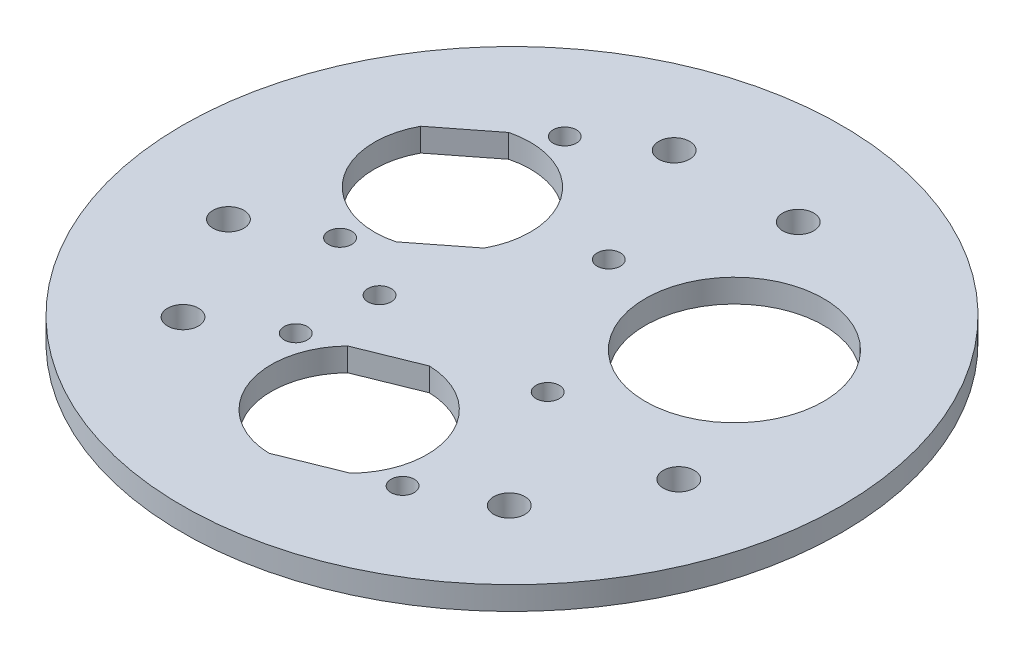
ISO-10303-21;
HEADER;
FILE_DESCRIPTION(('STEP AP214'),'2;1');
FILE_NAME('part.step','',(''),(''),'','','');
FILE_SCHEMA(('AUTOMOTIVE_DESIGN { 1 0 10303 214 1 1 1 1 }'));
ENDSEC;
DATA;
#1=APPLICATION_CONTEXT('core data for automotive mechanical design processes');
#2=APPLICATION_PROTOCOL_DEFINITION('international standard','automotive_design',2000,#1);
#3=PRODUCT_CONTEXT('',#1,'mechanical');
#4=PRODUCT('Part','Part','',(#3));
#5=PRODUCT_RELATED_PRODUCT_CATEGORY('part','',(#4));
#6=PRODUCT_DEFINITION_FORMATION('','',#4);
#7=PRODUCT_DEFINITION_CONTEXT('part definition',#1,'design');
#8=PRODUCT_DEFINITION('design','',#6,#7);
#9=PRODUCT_DEFINITION_SHAPE('','',#8);
#10=(LENGTH_UNIT() NAMED_UNIT(*) SI_UNIT(.MILLI.,.METRE.));
#11=(NAMED_UNIT(*) PLANE_ANGLE_UNIT() SI_UNIT($,.RADIAN.));
#12=(NAMED_UNIT(*) SI_UNIT($,.STERADIAN.) SOLID_ANGLE_UNIT());
#13=UNCERTAINTY_MEASURE_WITH_UNIT(LENGTH_MEASURE(1.E-05),#10,'distance_accuracy_value','');
#14=(GEOMETRIC_REPRESENTATION_CONTEXT(3) GLOBAL_UNCERTAINTY_ASSIGNED_CONTEXT((#13)) GLOBAL_UNIT_ASSIGNED_CONTEXT((#10,
#11,#12)) REPRESENTATION_CONTEXT('',''));
#15=CARTESIAN_POINT('',(0.,0.,0.));
#16=DIRECTION('',(0.,0.,1.));
#17=DIRECTION('',(1.,0.,0.));
#18=AXIS2_PLACEMENT_3D('',#15,#16,#17);
#19=CARTESIAN_POINT('',(0.,-72.,21.));
#20=DIRECTION('',(0.,-1.,0.));
#21=DIRECTION('',(0.,0.,1.));
#22=AXIS2_PLACEMENT_3D('',#19,#20,#21);
#23=CYLINDRICAL_SURFACE('',#22,10.05);
#24=CARTESIAN_POINT('',(0.,-74.,21.));
#25=DIRECTION('',(0.,1.,0.));
#26=DIRECTION('',(-1.,0.,0.));
#27=AXIS2_PLACEMENT_3D('',#24,#25,#26);
#28=CIRCLE('',#27,10.05);
#29=CARTESIAN_POINT('',(7.19689378985541,-74.,28.014785796982));
#30=VERTEX_POINT('',#29);
#31=CARTESIAN_POINT('',(0.304132471002682,-74.,10.9546028729531));
#32=VERTEX_POINT('',#31);
#33=EDGE_CURVE('E151',#30,#32,#28,.T.);
#34=ORIENTED_EDGE('',*,*,#33,.F.);
#35=DIRECTION('',(0.,-1.,0.));
#36=VECTOR('',#35,1.);
#37=CARTESIAN_POINT('',(7.19689378985541,-72.,28.014785796982));
#38=LINE('',#37,#36);
#39=CARTESIAN_POINT('',(7.19689378985541,-71.,28.014785796982));
#40=VERTEX_POINT('',#39);
#41=EDGE_CURVE('E270',#40,#30,#38,.T.);
#42=ORIENTED_EDGE('',*,*,#41,.F.);
#43=CARTESIAN_POINT('',(0.,-71.,21.));
#44=DIRECTION('',(0.,1.,0.));
#45=DIRECTION('',(0.,0.,-1.));
#46=AXIS2_PLACEMENT_3D('',#43,#44,#45);
#47=CIRCLE('',#46,10.05);
#48=CARTESIAN_POINT('',(0.304132471002682,-71.,10.9546028729531));
#49=VERTEX_POINT('',#48);
#50=EDGE_CURVE('E53',#40,#49,#47,.T.);
#51=ORIENTED_EDGE('',*,*,#50,.T.);
#52=DIRECTION('',(0.,-1.,0.));
#53=VECTOR('',#52,1.);
#54=CARTESIAN_POINT('',(0.304132471002682,-72.,10.9546028729531));
#55=LINE('',#54,#53);
#56=EDGE_CURVE('E184',#49,#32,#55,.T.);
#57=ORIENTED_EDGE('',*,*,#56,.T.);
#58=EDGE_LOOP('',(#34,#42,#51,#57));
#59=FACE_BOUND('',#58,.T.);
#60=ADVANCED_FACE('F43',(#59),#23,.F.);
#61=CARTESIAN_POINT('',(-18.1865334794732,-72.,-10.5));
#62=DIRECTION('',(0.,-1.,0.));
#63=DIRECTION('',(0.,0.,1.));
#64=AXIS2_PLACEMENT_3D('',#61,#62,#63);
#65=CYLINDRICAL_SURFACE('',#64,10.05);
#66=CARTESIAN_POINT('',(-18.1865334794732,-74.,-10.5));
#67=DIRECTION('',(0.,1.,0.));
#68=DIRECTION('',(-1.,0.,0.));
#69=AXIS2_PLACEMENT_3D('',#66,#67,#68);
#70=CIRCLE('',#69,10.05);
#71=CARTESIAN_POINT('',(-27.0381688181003,-74.,-15.2593121175194));
#72=VERTEX_POINT('',#71);
#73=CARTESIAN_POINT('',(-15.7099976721082,-74.,-0.759914251155745));
#74=VERTEX_POINT('',#73);
#75=EDGE_CURVE('E123',#72,#74,#70,.T.);
#76=ORIENTED_EDGE('',*,*,#75,.F.);
#77=DIRECTION('',(0.,-1.,0.));
#78=VECTOR('',#77,1.);
#79=CARTESIAN_POINT('',(-27.0381688181003,-72.,-15.2593121175194));
#80=LINE('',#79,#78);
#81=CARTESIAN_POINT('',(-27.0381688181003,-71.,-15.2593121175194));
#82=VERTEX_POINT('',#81);
#83=EDGE_CURVE('E133',#82,#72,#80,.T.);
#84=ORIENTED_EDGE('',*,*,#83,.F.);
#85=CARTESIAN_POINT('',(-18.1865334794732,-71.,-10.5));
#86=DIRECTION('',(0.,1.,0.));
#87=DIRECTION('',(0.,0.,-1.));
#88=AXIS2_PLACEMENT_3D('',#85,#86,#87);
#89=CIRCLE('',#88,10.05);
#90=CARTESIAN_POINT('',(-15.7099976721082,-71.,-0.759914251155745));
#91=VERTEX_POINT('',#90);
#92=EDGE_CURVE('E158',#82,#91,#89,.T.);
#93=ORIENTED_EDGE('',*,*,#92,.T.);
#94=DIRECTION('',(0.,-1.,0.));
#95=VECTOR('',#94,1.);
#96=CARTESIAN_POINT('',(-15.7099976721082,-72.,-0.759914251155745));
#97=LINE('',#96,#95);
#98=EDGE_CURVE('E143',#91,#74,#97,.T.);
#99=ORIENTED_EDGE('',*,*,#98,.T.);
#100=EDGE_LOOP('',(#76,#84,#93,#99));
#101=FACE_BOUND('',#100,.T.);
#102=ADVANCED_FACE('F142',(#101),#65,.F.);
#103=CARTESIAN_POINT('',(0.,-71.,21.));
#104=DIRECTION('',(0.,1.,0.));
#105=DIRECTION('',(0.,0.,-1.));
#106=AXIS2_PLACEMENT_3D('',#103,#104,#105);
#107=CIRCLE('',#106,10.05);
#108=CARTESIAN_POINT('',(-7.1968937898554,-71.,13.985214203018));
#109=VERTEX_POINT('',#108);
#110=CARTESIAN_POINT('',(-0.304132471002672,-71.,31.0453971270469));
#111=VERTEX_POINT('',#110);
#112=EDGE_CURVE('E11',#109,#111,#107,.T.);
#113=ORIENTED_EDGE('',*,*,#112,.T.);
#114=DIRECTION('',(0.,-1.,0.));
#115=VECTOR('',#114,1.);
#116=CARTESIAN_POINT('',(-0.304132471002672,-72.,31.0453971270469));
#117=LINE('',#116,#115);
#118=CARTESIAN_POINT('',(-0.304132471002672,-74.,31.0453971270469));
#119=VERTEX_POINT('',#118);
#120=EDGE_CURVE('E179',#111,#119,#117,.T.);
#121=ORIENTED_EDGE('',*,*,#120,.T.);
#122=CARTESIAN_POINT('',(-7.19689378985539,-74.,13.985214203018));
#123=VERTEX_POINT('',#122);
#124=EDGE_CURVE('E145',#123,#119,#28,.T.);
#125=ORIENTED_EDGE('',*,*,#124,.F.);
#126=DIRECTION('',(0.,-1.,0.));
#127=VECTOR('',#126,1.);
#128=CARTESIAN_POINT('',(-7.1968937898554,-72.,13.985214203018));
#129=LINE('',#128,#127);
#130=EDGE_CURVE('E130',#109,#123,#129,.T.);
#131=ORIENTED_EDGE('',*,*,#130,.F.);
#132=EDGE_LOOP('',(#113,#121,#125,#131));
#133=FACE_BOUND('',#132,.T.);
#134=ADVANCED_FACE('F266',(#133),#23,.F.);
#135=CARTESIAN_POINT('',(-18.1865334794732,-71.,-10.5));
#136=DIRECTION('',(0.,1.,0.));
#137=DIRECTION('',(0.,0.,-1.));
#138=AXIS2_PLACEMENT_3D('',#135,#136,#137);
#139=CIRCLE('',#138,10.05);
#140=CARTESIAN_POINT('',(-9.33489814084603,-71.,-5.74068788248061));
#141=VERTEX_POINT('',#140);
#142=CARTESIAN_POINT('',(-20.6630692868382,-71.,-20.2400857488443));
#143=VERTEX_POINT('',#142);
#144=EDGE_CURVE('E181',#141,#143,#139,.T.);
#145=ORIENTED_EDGE('',*,*,#144,.T.);
#146=DIRECTION('',(0.,-1.,0.));
#147=VECTOR('',#146,1.);
#148=CARTESIAN_POINT('',(-20.6630692868382,-72.,-20.2400857488443));
#149=LINE('',#148,#147);
#150=CARTESIAN_POINT('',(-20.6630692868382,-74.,-20.2400857488443));
#151=VERTEX_POINT('',#150);
#152=EDGE_CURVE('E139',#143,#151,#149,.T.);
#153=ORIENTED_EDGE('',*,*,#152,.T.);
#154=CARTESIAN_POINT('',(-9.33489814084604,-74.,-5.74068788248061));
#155=VERTEX_POINT('',#154);
#156=EDGE_CURVE('E126',#155,#151,#70,.T.);
#157=ORIENTED_EDGE('',*,*,#156,.F.);
#158=DIRECTION('',(0.,-1.,0.));
#159=VECTOR('',#158,1.);
#160=CARTESIAN_POINT('',(-9.33489814084603,-72.,-5.74068788248061));
#161=LINE('',#160,#159);
#162=EDGE_CURVE('E175',#141,#155,#161,.T.);
#163=ORIENTED_EDGE('',*,*,#162,.F.);
#164=EDGE_LOOP('',(#145,#153,#157,#163));
#165=FACE_BOUND('',#164,.T.);
#166=ADVANCED_FACE('F367',(#165),#65,.F.);
#167=CARTESIAN_POINT('',(0.,-72.,0.));
#168=DIRECTION('',(0.,-1.,0.));
#169=DIRECTION('',(0.,0.,1.));
#170=AXIS2_PLACEMENT_3D('',#167,#168,#169);
#171=CYLINDRICAL_SURFACE('',#170,42.5);
#172=CARTESIAN_POINT('',(0.,-71.,0.));
#173=DIRECTION('',(0.,1.,0.));
#174=DIRECTION('',(0.,0.,-1.));
#175=AXIS2_PLACEMENT_3D('',#172,#173,#174);
#176=CIRCLE('',#175,42.5);
#177=CARTESIAN_POINT('',(-42.5,-71.,0.));
#178=VERTEX_POINT('',#177);
#179=EDGE_CURVE('E47',#178,#178,#176,.T.);
#180=ORIENTED_EDGE('',*,*,#179,.F.);
#181=EDGE_LOOP('',(#180));
#182=FACE_BOUND('',#181,.T.);
#183=CARTESIAN_POINT('',(0.,-74.,0.));
#184=DIRECTION('',(0.,1.,0.));
#185=DIRECTION('',(-1.,0.,0.));
#186=AXIS2_PLACEMENT_3D('',#183,#184,#185);
#187=CIRCLE('',#186,42.5);
#188=CARTESIAN_POINT('',(-42.5,-74.,0.));
#189=VERTEX_POINT('',#188);
#190=EDGE_CURVE('E106',#189,#189,#187,.T.);
#191=ORIENTED_EDGE('',*,*,#190,.T.);
#192=EDGE_LOOP('',(#191));
#193=FACE_BOUND('',#192,.T.);
#194=ADVANCED_FACE('F374',(#182,#193),#171,.T.);
#195=CARTESIAN_POINT('',(0.,-71.,0.));
#196=DIRECTION('',(0.,1.,0.));
#197=DIRECTION('',(-1.,0.,0.));
#198=AXIS2_PLACEMENT_3D('',#195,#196,#197);
#199=PLANE('',#198);
#200=CARTESIAN_POINT('',(18.1865334794732,-71.,-10.5));
#201=DIRECTION('',(0.,-1.,0.));
#202=DIRECTION('',(0.,0.,1.));
#203=AXIS2_PLACEMENT_3D('',#200,#201,#202);
#204=CIRCLE('',#203,11.5);
#205=CARTESIAN_POINT('',(18.1865334794732,-71.,1.));
#206=VERTEX_POINT('',#205);
#207=EDGE_CURVE('E303',#206,#206,#204,.T.);
#208=ORIENTED_EDGE('',*,*,#207,.T.);
#209=EDGE_LOOP('',(#208));
#210=FACE_BOUND('',#209,.T.);
#211=CARTESIAN_POINT('',(-10.8160076466377,-71.,6.26609755652382));
#212=DIRECTION('',(0.,-1.,0.));
#213=DIRECTION('',(0.,0.,1.));
#214=AXIS2_PLACEMENT_3D('',#211,#212,#213);
#215=CIRCLE('',#214,1.5);
#216=CARTESIAN_POINT('',(-10.8160076466377,-71.,7.76609755652382));
#217=VERTEX_POINT('',#216);
#218=EDGE_CURVE('E291',#217,#217,#215,.T.);
#219=ORIENTED_EDGE('',*,*,#218,.T.);
#220=EDGE_LOOP('',(#219));
#221=FACE_BOUND('',#220,.T.);
#222=CARTESIAN_POINT('',(10.8346034898601,-71.,6.23388861125312));
#223=DIRECTION('',(0.,-1.,0.));
#224=DIRECTION('',(0.,0.,1.));
#225=AXIS2_PLACEMENT_3D('',#222,#223,#224);
#226=CIRCLE('',#225,1.5);
#227=CARTESIAN_POINT('',(10.8346034898601,-71.,7.73388861125312));
#228=VERTEX_POINT('',#227);
#229=EDGE_CURVE('E310',#228,#228,#226,.T.);
#230=ORIENTED_EDGE('',*,*,#229,.T.);
#231=EDGE_LOOP('',(#230));
#232=FACE_BOUND('',#231,.T.);
#233=CARTESIAN_POINT('',(-0.018595843222347,-71.,-12.4999861677769));
#234=DIRECTION('',(0.,-1.,0.));
#235=DIRECTION('',(0.,0.,1.));
#236=AXIS2_PLACEMENT_3D('',#233,#234,#235);
#237=CIRCLE('',#236,1.5);
#238=CARTESIAN_POINT('',(-0.0185958432223473,-71.,-10.9999861677769));
#239=VERTEX_POINT('',#238);
#240=EDGE_CURVE('E302',#239,#239,#237,.T.);
#241=ORIENTED_EDGE('',*,*,#240,.T.);
#242=EDGE_LOOP('',(#241));
#243=FACE_BOUND('',#242,.T.);
#244=CARTESIAN_POINT('',(-16.6022320152063,-71.,-23.4030999713372));
#245=DIRECTION('',(0.,1.,0.));
#246=DIRECTION('',(0.,0.,-1.));
#247=AXIS2_PLACEMENT_3D('',#244,#245,#246);
#248=CIRCLE('',#247,1.50000000000002);
#249=CARTESIAN_POINT('',(-16.6022320152063,-71.,-24.9030999713372));
#250=VERTEX_POINT('',#249);
#251=EDGE_CURVE('E160',#250,#250,#248,.F.);
#252=ORIENTED_EDGE('',*,*,#251,.T.);
#253=EDGE_LOOP('',(#252));
#254=FACE_BOUND('',#253,.T.);
#255=CARTESIAN_POINT('',(-19.77083494374,-71.,2.40309997133719));
#256=DIRECTION('',(0.,1.,0.));
#257=DIRECTION('',(0.,0.,-1.));
#258=AXIS2_PLACEMENT_3D('',#255,#256,#257);
#259=CIRCLE('',#258,1.50000000000002);
#260=CARTESIAN_POINT('',(-19.77083494374,-71.,0.903099971337171));
#261=VERTEX_POINT('',#260);
#262=EDGE_CURVE('E165',#261,#261,#259,.F.);
#263=ORIENTED_EDGE('',*,*,#262,.T.);
#264=EDGE_LOOP('',(#263));
#265=FACE_BOUND('',#264,.T.);
#266=CARTESIAN_POINT('',(-11.9665630948817,-71.,15.9204953296394));
#267=DIRECTION('',(0.,1.,0.));
#268=DIRECTION('',(0.,0.,-1.));
#269=AXIS2_PLACEMENT_3D('',#266,#267,#268);
#270=CIRCLE('',#269,1.5);
#271=CARTESIAN_POINT('',(-11.9665630948817,-71.,14.4204953296393));
#272=VERTEX_POINT('',#271);
#273=EDGE_CURVE('E169',#272,#272,#270,.F.);
#274=ORIENTED_EDGE('',*,*,#273,.T.);
#275=EDGE_LOOP('',(#274));
#276=FACE_BOUND('',#275,.T.);
#277=CARTESIAN_POINT('',(11.9665630948817,-71.,26.0795046703606));
#278=DIRECTION('',(0.,1.,0.));
#279=DIRECTION('',(0.,0.,-1.));
#280=AXIS2_PLACEMENT_3D('',#277,#278,#279);
#281=CIRCLE('',#280,1.5);
#282=CARTESIAN_POINT('',(11.9665630948817,-71.,24.5795046703606));
#283=VERTEX_POINT('',#282);
#284=EDGE_CURVE('E173',#283,#283,#281,.F.);
#285=ORIENTED_EDGE('',*,*,#284,.T.);
#286=EDGE_LOOP('',(#285));
#287=FACE_BOUND('',#286,.T.);
#288=ORIENTED_EDGE('',*,*,#112,.F.);
#289=DIRECTION('',(-0.927183854566788,0.,0.374606593415909));
#290=VECTOR('',#289,1.);
#291=CARTESIAN_POINT('',(-7.1968937898554,-71.,13.985214203018));
#292=LINE('',#291,#290);
#293=EDGE_CURVE('E182',#49,#109,#292,.T.);
#294=ORIENTED_EDGE('',*,*,#293,.F.);
#295=ORIENTED_EDGE('',*,*,#50,.F.);
#296=DIRECTION('',(0.927183854566789,0.,-0.374606593415909));
#297=VECTOR('',#296,1.);
#298=CARTESIAN_POINT('',(-0.304132471002672,-71.,31.0453971270469));
#299=LINE('',#298,#297);
#300=EDGE_CURVE('E177',#111,#40,#299,.T.);
#301=ORIENTED_EDGE('',*,*,#300,.F.);
#302=EDGE_LOOP('',(#288,#294,#295,#301));
#303=FACE_BOUND('',#302,.T.);
#304=CARTESIAN_POINT('',(-21.0399680510976,-71.,21.3850355250763));
#305=DIRECTION('',(0.,1.,0.));
#306=DIRECTION('',(0.,0.,-1.));
#307=AXIS2_PLACEMENT_3D('',#304,#305,#306);
#308=CIRCLE('',#307,2.);
#309=CARTESIAN_POINT('',(-21.0399680510976,-71.,19.3850355250763));
#310=VERTEX_POINT('',#309);
#311=EDGE_CURVE('E186',#310,#310,#308,.T.);
#312=ORIENTED_EDGE('',*,*,#311,.F.);
#313=EDGE_LOOP('',(#312));
#314=FACE_BOUND('',#313,.T.);
#315=CARTESIAN_POINT('',(-29.0399680510976,-71.,7.52862906452531));
#316=DIRECTION('',(0.,1.,0.));
#317=DIRECTION('',(0.,0.,-1.));
#318=AXIS2_PLACEMENT_3D('',#315,#316,#317);
#319=CIRCLE('',#318,2.);
#320=CARTESIAN_POINT('',(-29.0399680510976,-71.,5.52862906452532));
#321=VERTEX_POINT('',#320);
#322=EDGE_CURVE('E191',#321,#321,#319,.T.);
#323=ORIENTED_EDGE('',*,*,#322,.F.);
#324=EDGE_LOOP('',(#323));
#325=FACE_BOUND('',#324,.T.);
#326=CARTESIAN_POINT('',(29.0399680510976,-71.,7.52862906452534));
#327=DIRECTION('',(0.,1.,0.));
#328=DIRECTION('',(0.,0.,-1.));
#329=AXIS2_PLACEMENT_3D('',#326,#327,#328);
#330=CIRCLE('',#329,2.);
#331=CARTESIAN_POINT('',(29.0399680510976,-71.,5.52862906452534));
#332=VERTEX_POINT('',#331);
#333=EDGE_CURVE('E196',#332,#332,#330,.T.);
#334=ORIENTED_EDGE('',*,*,#333,.F.);
#335=EDGE_LOOP('',(#334));
#336=FACE_BOUND('',#335,.T.);
#337=CARTESIAN_POINT('',(21.0399680510976,-71.,21.3850355250763));
#338=DIRECTION('',(0.,1.,0.));
#339=DIRECTION('',(0.,0.,-1.));
#340=AXIS2_PLACEMENT_3D('',#337,#338,#339);
#341=CIRCLE('',#340,2.);
#342=CARTESIAN_POINT('',(21.0399680510976,-71.,19.3850355250764));
#343=VERTEX_POINT('',#342);
#344=EDGE_CURVE('E200',#343,#343,#341,.T.);
#345=ORIENTED_EDGE('',*,*,#344,.F.);
#346=EDGE_LOOP('',(#345));
#347=FACE_BOUND('',#346,.T.);
#348=CARTESIAN_POINT('',(-7.99999999999999,-71.,-28.9136645896017));
#349=DIRECTION('',(0.,1.,0.));
#350=DIRECTION('',(0.,0.,-1.));
#351=AXIS2_PLACEMENT_3D('',#348,#349,#350);
#352=CIRCLE('',#351,2.);
#353=CARTESIAN_POINT('',(-7.99999999999999,-71.,-30.9136645896017));
#354=VERTEX_POINT('',#353);
#355=EDGE_CURVE('E204',#354,#354,#352,.T.);
#356=ORIENTED_EDGE('',*,*,#355,.F.);
#357=EDGE_LOOP('',(#356));
#358=FACE_BOUND('',#357,.T.);
#359=CARTESIAN_POINT('',(8.,-71.,-28.9136645896017));
#360=DIRECTION('',(0.,1.,0.));
#361=DIRECTION('',(0.,0.,-1.));
#362=AXIS2_PLACEMENT_3D('',#359,#360,#361);
#363=CIRCLE('',#362,2.);
#364=CARTESIAN_POINT('',(8.,-71.,-30.9136645896017));
#365=VERTEX_POINT('',#364);
#366=EDGE_CURVE('E207',#365,#365,#363,.T.);
#367=ORIENTED_EDGE('',*,*,#366,.F.);
#368=EDGE_LOOP('',(#367));
#369=FACE_BOUND('',#368,.T.);
#370=ORIENTED_EDGE('',*,*,#144,.F.);
#371=DIRECTION('',(0.78801075360672,0.,-0.61566147532566));
#372=VECTOR('',#371,1.);
#373=CARTESIAN_POINT('',(-15.7099976721082,-71.,-0.759914251155745));
#374=LINE('',#373,#372);
#375=EDGE_CURVE('E100',#91,#141,#374,.T.);
#376=ORIENTED_EDGE('',*,*,#375,.F.);
#377=ORIENTED_EDGE('',*,*,#92,.F.);
#378=DIRECTION('',(-0.78801075360672,0.,0.61566147532566));
#379=VECTOR('',#378,1.);
#380=CARTESIAN_POINT('',(-27.0381688181003,-71.,-15.2593121175194));
#381=LINE('',#380,#379);
#382=EDGE_CURVE('E129',#143,#82,#381,.T.);
#383=ORIENTED_EDGE('',*,*,#382,.F.);
#384=EDGE_LOOP('',(#370,#376,#377,#383));
#385=FACE_BOUND('',#384,.T.);
#386=ORIENTED_EDGE('',*,*,#179,.T.);
#387=EDGE_LOOP('',(#386));
#388=FACE_BOUND('',#387,.T.);
#389=ADVANCED_FACE('F45',(#210,#221,#232,#243,#254,#265,#276,#287,#303,#314,#325,#336,#347,#358,
#369,#385,#388),#199,.T.);
#390=CARTESIAN_POINT('',(0.,-74.,0.));
#391=DIRECTION('',(0.,1.,0.));
#392=DIRECTION('',(-1.,0.,0.));
#393=AXIS2_PLACEMENT_3D('',#390,#391,#392);
#394=PLANE('',#393);
#395=CARTESIAN_POINT('',(18.1865334794732,-74.,-10.5));
#396=DIRECTION('',(0.,-1.,0.));
#397=DIRECTION('',(0.,0.,1.));
#398=AXIS2_PLACEMENT_3D('',#395,#396,#397);
#399=CIRCLE('',#398,11.5);
#400=CARTESIAN_POINT('',(18.1865334794732,-74.,1.));
#401=VERTEX_POINT('',#400);
#402=EDGE_CURVE('E315',#401,#401,#399,.T.);
#403=ORIENTED_EDGE('',*,*,#402,.F.);
#404=EDGE_LOOP('',(#403));
#405=FACE_BOUND('',#404,.T.);
#406=CARTESIAN_POINT('',(-10.8160076466377,-74.,6.26609755652382));
#407=DIRECTION('',(0.,-1.,0.));
#408=DIRECTION('',(0.,0.,1.));
#409=AXIS2_PLACEMENT_3D('',#406,#407,#408);
#410=CIRCLE('',#409,1.5);
#411=CARTESIAN_POINT('',(-10.8160076466377,-74.,7.76609755652382));
#412=VERTEX_POINT('',#411);
#413=EDGE_CURVE('E296',#412,#412,#410,.T.);
#414=ORIENTED_EDGE('',*,*,#413,.F.);
#415=EDGE_LOOP('',(#414));
#416=FACE_BOUND('',#415,.T.);
#417=CARTESIAN_POINT('',(10.8346034898601,-74.,6.23388861125312));
#418=DIRECTION('',(0.,-1.,0.));
#419=DIRECTION('',(0.,0.,1.));
#420=AXIS2_PLACEMENT_3D('',#417,#418,#419);
#421=CIRCLE('',#420,1.5);
#422=CARTESIAN_POINT('',(10.8346034898601,-74.,7.73388861125312));
#423=VERTEX_POINT('',#422);
#424=EDGE_CURVE('E307',#423,#423,#421,.T.);
#425=ORIENTED_EDGE('',*,*,#424,.F.);
#426=EDGE_LOOP('',(#425));
#427=FACE_BOUND('',#426,.T.);
#428=CARTESIAN_POINT('',(-0.018595843222347,-74.,-12.4999861677769));
#429=DIRECTION('',(0.,-1.,0.));
#430=DIRECTION('',(0.,0.,1.));
#431=AXIS2_PLACEMENT_3D('',#428,#429,#430);
#432=CIRCLE('',#431,1.5);
#433=CARTESIAN_POINT('',(-0.0185958432223473,-74.,-10.9999861677769));
#434=VERTEX_POINT('',#433);
#435=EDGE_CURVE('E299',#434,#434,#432,.T.);
#436=ORIENTED_EDGE('',*,*,#435,.F.);
#437=EDGE_LOOP('',(#436));
#438=FACE_BOUND('',#437,.T.);
#439=CARTESIAN_POINT('',(-16.6022320152063,-74.,-23.4030999713372));
#440=DIRECTION('',(0.,-1.,0.));
#441=DIRECTION('',(0.,0.,1.));
#442=AXIS2_PLACEMENT_3D('',#439,#440,#441);
#443=CIRCLE('',#442,1.50000000000002);
#444=CARTESIAN_POINT('',(-16.6022320152063,-74.,-21.9030999713372));
#445=VERTEX_POINT('',#444);
#446=EDGE_CURVE('E163',#445,#445,#443,.T.);
#447=ORIENTED_EDGE('',*,*,#446,.F.);
#448=EDGE_LOOP('',(#447));
#449=FACE_BOUND('',#448,.T.);
#450=CARTESIAN_POINT('',(-19.77083494374,-74.,2.40309997133719));
#451=DIRECTION('',(0.,-1.,0.));
#452=DIRECTION('',(0.,0.,-1.));
#453=AXIS2_PLACEMENT_3D('',#450,#451,#452);
#454=CIRCLE('',#453,1.50000000000002);
#455=CARTESIAN_POINT('',(-19.77083494374,-74.,0.903099971337171));
#456=VERTEX_POINT('',#455);
#457=EDGE_CURVE('E164',#456,#456,#454,.T.);
#458=ORIENTED_EDGE('',*,*,#457,.F.);
#459=EDGE_LOOP('',(#458));
#460=FACE_BOUND('',#459,.T.);
#461=CARTESIAN_POINT('',(-11.9665630948817,-74.,15.9204953296394));
#462=DIRECTION('',(0.,-1.,0.));
#463=DIRECTION('',(0.,0.,1.));
#464=AXIS2_PLACEMENT_3D('',#461,#462,#463);
#465=CIRCLE('',#464,1.5);
#466=CARTESIAN_POINT('',(-11.9665630948817,-74.,17.4204953296394));
#467=VERTEX_POINT('',#466);
#468=EDGE_CURVE('E168',#467,#467,#465,.T.);
#469=ORIENTED_EDGE('',*,*,#468,.F.);
#470=EDGE_LOOP('',(#469));
#471=FACE_BOUND('',#470,.T.);
#472=CARTESIAN_POINT('',(11.9665630948817,-74.,26.0795046703606));
#473=DIRECTION('',(0.,-1.,0.));
#474=DIRECTION('',(0.,0.,-1.));
#475=AXIS2_PLACEMENT_3D('',#472,#473,#474);
#476=CIRCLE('',#475,1.5);
#477=CARTESIAN_POINT('',(11.9665630948817,-74.,24.5795046703606));
#478=VERTEX_POINT('',#477);
#479=EDGE_CURVE('E172',#478,#478,#476,.T.);
#480=ORIENTED_EDGE('',*,*,#479,.F.);
#481=EDGE_LOOP('',(#480));
#482=FACE_BOUND('',#481,.T.);
#483=ORIENTED_EDGE('',*,*,#156,.T.);
#484=DIRECTION('',(-0.78801075360672,0.,0.61566147532566));
#485=VECTOR('',#484,1.);
#486=CARTESIAN_POINT('',(-27.0381688181003,-74.,-15.2593121175194));
#487=LINE('',#486,#485);
#488=EDGE_CURVE('E118',#151,#72,#487,.T.);
#489=ORIENTED_EDGE('',*,*,#488,.T.);
#490=ORIENTED_EDGE('',*,*,#75,.T.);
#491=DIRECTION('',(0.78801075360672,0.,-0.61566147532566));
#492=VECTOR('',#491,1.);
#493=CARTESIAN_POINT('',(-15.7099976721082,-74.,-0.759914251155745));
#494=LINE('',#493,#492);
#495=EDGE_CURVE('E138',#74,#155,#494,.T.);
#496=ORIENTED_EDGE('',*,*,#495,.T.);
#497=EDGE_LOOP('',(#483,#489,#490,#496));
#498=FACE_BOUND('',#497,.T.);
#499=CARTESIAN_POINT('',(-21.0399680510976,-74.,21.3850355250763));
#500=DIRECTION('',(0.,-1.,0.));
#501=DIRECTION('',(0.,0.,1.));
#502=AXIS2_PLACEMENT_3D('',#499,#500,#501);
#503=CIRCLE('',#502,2.);
#504=CARTESIAN_POINT('',(-21.0399680510976,-74.,23.3850355250763));
#505=VERTEX_POINT('',#504);
#506=EDGE_CURVE('E190',#505,#505,#503,.T.);
#507=ORIENTED_EDGE('',*,*,#506,.F.);
#508=EDGE_LOOP('',(#507));
#509=FACE_BOUND('',#508,.T.);
#510=CARTESIAN_POINT('',(-29.0399680510976,-74.,7.52862906452531));
#511=DIRECTION('',(0.,-1.,0.));
#512=DIRECTION('',(0.,0.,1.));
#513=AXIS2_PLACEMENT_3D('',#510,#511,#512);
#514=CIRCLE('',#513,2.);
#515=CARTESIAN_POINT('',(-29.0399680510976,-74.,9.52862906452531));
#516=VERTEX_POINT('',#515);
#517=EDGE_CURVE('E189',#516,#516,#514,.T.);
#518=ORIENTED_EDGE('',*,*,#517,.F.);
#519=EDGE_LOOP('',(#518));
#520=FACE_BOUND('',#519,.T.);
#521=CARTESIAN_POINT('',(29.0399680510976,-74.,7.52862906452534));
#522=DIRECTION('',(0.,-1.,0.));
#523=DIRECTION('',(0.,0.,1.));
#524=AXIS2_PLACEMENT_3D('',#521,#522,#523);
#525=CIRCLE('',#524,2.);
#526=CARTESIAN_POINT('',(29.0399680510976,-74.,9.52862906452534));
#527=VERTEX_POINT('',#526);
#528=EDGE_CURVE('E195',#527,#527,#525,.T.);
#529=ORIENTED_EDGE('',*,*,#528,.F.);
#530=EDGE_LOOP('',(#529));
#531=FACE_BOUND('',#530,.T.);
#532=CARTESIAN_POINT('',(21.0399680510976,-74.,21.3850355250763));
#533=DIRECTION('',(0.,-1.,0.));
#534=DIRECTION('',(0.,0.,1.));
#535=AXIS2_PLACEMENT_3D('',#532,#533,#534);
#536=CIRCLE('',#535,2.);
#537=CARTESIAN_POINT('',(21.0399680510976,-74.,23.3850355250763));
#538=VERTEX_POINT('',#537);
#539=EDGE_CURVE('E199',#538,#538,#536,.T.);
#540=ORIENTED_EDGE('',*,*,#539,.F.);
#541=EDGE_LOOP('',(#540));
#542=FACE_BOUND('',#541,.T.);
#543=CARTESIAN_POINT('',(-7.99999999999999,-74.,-28.9136645896017));
#544=DIRECTION('',(0.,-1.,0.));
#545=DIRECTION('',(0.,0.,1.));
#546=AXIS2_PLACEMENT_3D('',#543,#544,#545);
#547=CIRCLE('',#546,2.);
#548=CARTESIAN_POINT('',(-7.99999999999999,-74.,-26.9136645896017));
#549=VERTEX_POINT('',#548);
#550=EDGE_CURVE('E203',#549,#549,#547,.T.);
#551=ORIENTED_EDGE('',*,*,#550,.F.);
#552=EDGE_LOOP('',(#551));
#553=FACE_BOUND('',#552,.T.);
#554=CARTESIAN_POINT('',(8.,-74.,-28.9136645896017));
#555=DIRECTION('',(0.,-1.,0.));
#556=DIRECTION('',(0.,0.,1.));
#557=AXIS2_PLACEMENT_3D('',#554,#555,#556);
#558=CIRCLE('',#557,2.);
#559=CARTESIAN_POINT('',(8.,-74.,-26.9136645896017));
#560=VERTEX_POINT('',#559);
#561=EDGE_CURVE('E155',#560,#560,#558,.T.);
#562=ORIENTED_EDGE('',*,*,#561,.F.);
#563=EDGE_LOOP('',(#562));
#564=FACE_BOUND('',#563,.T.);
#565=ORIENTED_EDGE('',*,*,#124,.T.);
#566=DIRECTION('',(0.927183854566789,0.,-0.374606593415909));
#567=VECTOR('',#566,1.);
#568=CARTESIAN_POINT('',(-0.304132471002672,-74.,31.0453971270469));
#569=LINE('',#568,#567);
#570=EDGE_CURVE('E62',#119,#30,#569,.T.);
#571=ORIENTED_EDGE('',*,*,#570,.T.);
#572=ORIENTED_EDGE('',*,*,#33,.T.);
#573=DIRECTION('',(-0.927183854566788,0.,0.374606593415909));
#574=VECTOR('',#573,1.);
#575=CARTESIAN_POINT('',(-7.1968937898554,-74.,13.985214203018));
#576=LINE('',#575,#574);
#577=EDGE_CURVE('E185',#32,#123,#576,.T.);
#578=ORIENTED_EDGE('',*,*,#577,.T.);
#579=EDGE_LOOP('',(#565,#571,#572,#578));
#580=FACE_BOUND('',#579,.T.);
#581=ORIENTED_EDGE('',*,*,#190,.F.);
#582=EDGE_LOOP('',(#581));
#583=FACE_BOUND('',#582,.T.);
#584=ADVANCED_FACE('F120',(#405,#416,#427,#438,#449,#460,#471,#482,#498,#509,#520,#531,#542,
#553,#564,#580,#583),#394,.F.);
#585=CARTESIAN_POINT('',(8.,-74.,-28.9136645896017));
#586=DIRECTION('',(0.,-1.,0.));
#587=DIRECTION('',(0.,0.,1.));
#588=AXIS2_PLACEMENT_3D('',#585,#586,#587);
#589=CYLINDRICAL_SURFACE('',#588,2.);
#590=ORIENTED_EDGE('',*,*,#366,.T.);
#591=EDGE_LOOP('',(#590));
#592=FACE_BOUND('',#591,.T.);
#593=ORIENTED_EDGE('',*,*,#561,.T.);
#594=EDGE_LOOP('',(#593));
#595=FACE_BOUND('',#594,.T.);
#596=ADVANCED_FACE('F255',(#592,#595),#589,.F.);
#597=CARTESIAN_POINT('',(-7.99999999999999,-74.,-28.9136645896017));
#598=DIRECTION('',(0.,-1.,0.));
#599=DIRECTION('',(0.,0.,1.));
#600=AXIS2_PLACEMENT_3D('',#597,#598,#599);
#601=CYLINDRICAL_SURFACE('',#600,2.);
#602=ORIENTED_EDGE('',*,*,#355,.T.);
#603=EDGE_LOOP('',(#602));
#604=FACE_BOUND('',#603,.T.);
#605=ORIENTED_EDGE('',*,*,#550,.T.);
#606=EDGE_LOOP('',(#605));
#607=FACE_BOUND('',#606,.T.);
#608=ADVANCED_FACE('F251',(#604,#607),#601,.F.);
#609=CARTESIAN_POINT('',(21.0399680510976,-74.,21.3850355250763));
#610=DIRECTION('',(0.,-1.,0.));
#611=DIRECTION('',(0.,0.,1.));
#612=AXIS2_PLACEMENT_3D('',#609,#610,#611);
#613=CYLINDRICAL_SURFACE('',#612,2.);
#614=ORIENTED_EDGE('',*,*,#344,.T.);
#615=EDGE_LOOP('',(#614));
#616=FACE_BOUND('',#615,.T.);
#617=ORIENTED_EDGE('',*,*,#539,.T.);
#618=EDGE_LOOP('',(#617));
#619=FACE_BOUND('',#618,.T.);
#620=ADVANCED_FACE('F425',(#616,#619),#613,.F.);
#621=CARTESIAN_POINT('',(29.0399680510976,-74.,7.52862906452534));
#622=DIRECTION('',(0.,-1.,0.));
#623=DIRECTION('',(0.,0.,1.));
#624=AXIS2_PLACEMENT_3D('',#621,#622,#623);
#625=CYLINDRICAL_SURFACE('',#624,2.);
#626=ORIENTED_EDGE('',*,*,#333,.T.);
#627=EDGE_LOOP('',(#626));
#628=FACE_BOUND('',#627,.T.);
#629=ORIENTED_EDGE('',*,*,#528,.T.);
#630=EDGE_LOOP('',(#629));
#631=FACE_BOUND('',#630,.T.);
#632=ADVANCED_FACE('F432',(#628,#631),#625,.F.);
#633=CARTESIAN_POINT('',(-29.0399680510976,-74.,7.52862906452531));
#634=DIRECTION('',(0.,-1.,0.));
#635=DIRECTION('',(0.,0.,1.));
#636=AXIS2_PLACEMENT_3D('',#633,#634,#635);
#637=CYLINDRICAL_SURFACE('',#636,2.);
#638=ORIENTED_EDGE('',*,*,#322,.T.);
#639=EDGE_LOOP('',(#638));
#640=FACE_BOUND('',#639,.T.);
#641=ORIENTED_EDGE('',*,*,#517,.T.);
#642=EDGE_LOOP('',(#641));
#643=FACE_BOUND('',#642,.T.);
#644=ADVANCED_FACE('F357',(#640,#643),#637,.F.);
#645=CARTESIAN_POINT('',(-21.0399680510976,-74.,21.3850355250763));
#646=DIRECTION('',(0.,-1.,0.));
#647=DIRECTION('',(0.,0.,1.));
#648=AXIS2_PLACEMENT_3D('',#645,#646,#647);
#649=CYLINDRICAL_SURFACE('',#648,2.);
#650=ORIENTED_EDGE('',*,*,#311,.T.);
#651=EDGE_LOOP('',(#650));
#652=FACE_BOUND('',#651,.T.);
#653=ORIENTED_EDGE('',*,*,#506,.T.);
#654=EDGE_LOOP('',(#653));
#655=FACE_BOUND('',#654,.T.);
#656=ADVANCED_FACE('F347',(#652,#655),#649,.F.);
#657=CARTESIAN_POINT('',(11.9665630948817,-71.999,26.0795046703606));
#658=DIRECTION('',(0.,-1.,0.));
#659=DIRECTION('',(0.,0.,1.));
#660=AXIS2_PLACEMENT_3D('',#657,#658,#659);
#661=CYLINDRICAL_SURFACE('',#660,1.5);
#662=ORIENTED_EDGE('',*,*,#284,.F.);
#663=EDGE_LOOP('',(#662));
#664=FACE_BOUND('',#663,.T.);
#665=ORIENTED_EDGE('',*,*,#479,.T.);
#666=EDGE_LOOP('',(#665));
#667=FACE_BOUND('',#666,.T.);
#668=ADVANCED_FACE('F344',(#664,#667),#661,.F.);
#669=CARTESIAN_POINT('',(-11.9665630948817,-71.999,15.9204953296394));
#670=DIRECTION('',(0.,-1.,0.));
#671=DIRECTION('',(0.,0.,1.));
#672=AXIS2_PLACEMENT_3D('',#669,#670,#671);
#673=CYLINDRICAL_SURFACE('',#672,1.5);
#674=ORIENTED_EDGE('',*,*,#273,.F.);
#675=EDGE_LOOP('',(#674));
#676=FACE_BOUND('',#675,.T.);
#677=ORIENTED_EDGE('',*,*,#468,.T.);
#678=EDGE_LOOP('',(#677));
#679=FACE_BOUND('',#678,.T.);
#680=ADVANCED_FACE('F346',(#676,#679),#673,.F.);
#681=CARTESIAN_POINT('',(-19.77083494374,-71.999,2.40309997133719));
#682=DIRECTION('',(0.,-1.,0.));
#683=DIRECTION('',(0.,0.,1.));
#684=AXIS2_PLACEMENT_3D('',#681,#682,#683);
#685=CYLINDRICAL_SURFACE('',#684,1.50000000000002);
#686=ORIENTED_EDGE('',*,*,#262,.F.);
#687=EDGE_LOOP('',(#686));
#688=FACE_BOUND('',#687,.T.);
#689=ORIENTED_EDGE('',*,*,#457,.T.);
#690=EDGE_LOOP('',(#689));
#691=FACE_BOUND('',#690,.T.);
#692=ADVANCED_FACE('F354',(#688,#691),#685,.F.);
#693=CARTESIAN_POINT('',(-16.6022320152063,-71.999,-23.4030999713372));
#694=DIRECTION('',(0.,-1.,0.));
#695=DIRECTION('',(0.,0.,1.));
#696=AXIS2_PLACEMENT_3D('',#693,#694,#695);
#697=CYLINDRICAL_SURFACE('',#696,1.50000000000002);
#698=ORIENTED_EDGE('',*,*,#251,.F.);
#699=EDGE_LOOP('',(#698));
#700=FACE_BOUND('',#699,.T.);
#701=ORIENTED_EDGE('',*,*,#446,.T.);
#702=EDGE_LOOP('',(#701));
#703=FACE_BOUND('',#702,.T.);
#704=ADVANCED_FACE('F385',(#700,#703),#697,.F.);
#705=CARTESIAN_POINT('',(-15.7099976721082,-72.,-0.759914251155745));
#706=DIRECTION('',(-0.61566147532566,0.,-0.78801075360672));
#707=DIRECTION('',(-0.78801075360672,0.,0.61566147532566));
#708=AXIS2_PLACEMENT_3D('',#705,#706,#707);
#709=PLANE('',#708);
#710=ORIENTED_EDGE('',*,*,#495,.F.);
#711=ORIENTED_EDGE('',*,*,#98,.F.);
#712=ORIENTED_EDGE('',*,*,#375,.T.);
#713=ORIENTED_EDGE('',*,*,#162,.T.);
#714=EDGE_LOOP('',(#710,#711,#712,#713));
#715=FACE_BOUND('',#714,.T.);
#716=ADVANCED_FACE('F383',(#715),#709,.T.);
#717=CARTESIAN_POINT('',(-27.0381688181003,-72.,-15.2593121175194));
#718=DIRECTION('',(0.615661475325661,0.,0.78801075360672));
#719=DIRECTION('',(0.78801075360672,0.,-0.61566147532566));
#720=AXIS2_PLACEMENT_3D('',#717,#718,#719);
#721=PLANE('',#720);
#722=ORIENTED_EDGE('',*,*,#488,.F.);
#723=ORIENTED_EDGE('',*,*,#152,.F.);
#724=ORIENTED_EDGE('',*,*,#382,.T.);
#725=ORIENTED_EDGE('',*,*,#83,.T.);
#726=EDGE_LOOP('',(#722,#723,#724,#725));
#727=FACE_BOUND('',#726,.T.);
#728=ADVANCED_FACE('F134',(#727),#721,.T.);
#729=CARTESIAN_POINT('',(-7.1968937898554,-72.,13.985214203018));
#730=DIRECTION('',(0.374606593415909,0.,0.927183854566788));
#731=DIRECTION('',(0.927183854566788,0.,-0.374606593415909));
#732=AXIS2_PLACEMENT_3D('',#729,#730,#731);
#733=PLANE('',#732);
#734=ORIENTED_EDGE('',*,*,#577,.F.);
#735=ORIENTED_EDGE('',*,*,#56,.F.);
#736=ORIENTED_EDGE('',*,*,#293,.T.);
#737=ORIENTED_EDGE('',*,*,#130,.T.);
#738=EDGE_LOOP('',(#734,#735,#736,#737));
#739=FACE_BOUND('',#738,.T.);
#740=ADVANCED_FACE('F286',(#739),#733,.T.);
#741=CARTESIAN_POINT('',(-0.304132471002672,-72.,31.0453971270469));
#742=DIRECTION('',(-0.374606593415909,0.,-0.927183854566789));
#743=DIRECTION('',(-0.927183854566789,0.,0.374606593415909));
#744=AXIS2_PLACEMENT_3D('',#741,#742,#743);
#745=PLANE('',#744);
#746=ORIENTED_EDGE('',*,*,#570,.F.);
#747=ORIENTED_EDGE('',*,*,#120,.F.);
#748=ORIENTED_EDGE('',*,*,#300,.T.);
#749=ORIENTED_EDGE('',*,*,#41,.T.);
#750=EDGE_LOOP('',(#746,#747,#748,#749));
#751=FACE_BOUND('',#750,.T.);
#752=ADVANCED_FACE('F289',(#751),#745,.T.);
#753=CARTESIAN_POINT('',(-0.018595843222347,-71.,-12.4999861677769));
#754=DIRECTION('',(0.,-1.,0.));
#755=DIRECTION('',(0.,0.,1.));
#756=AXIS2_PLACEMENT_3D('',#753,#754,#755);
#757=CYLINDRICAL_SURFACE('',#756,1.5);
#758=ORIENTED_EDGE('',*,*,#240,.F.);
#759=EDGE_LOOP('',(#758));
#760=FACE_BOUND('',#759,.T.);
#761=ORIENTED_EDGE('',*,*,#435,.T.);
#762=EDGE_LOOP('',(#761));
#763=FACE_BOUND('',#762,.T.);
#764=ADVANCED_FACE('F494',(#760,#763),#757,.F.);
#765=CARTESIAN_POINT('',(10.8346034898601,-71.,6.23388861125312));
#766=DIRECTION('',(0.,-1.,0.));
#767=DIRECTION('',(0.,0.,1.));
#768=AXIS2_PLACEMENT_3D('',#765,#766,#767);
#769=CYLINDRICAL_SURFACE('',#768,1.5);
#770=ORIENTED_EDGE('',*,*,#229,.F.);
#771=EDGE_LOOP('',(#770));
#772=FACE_BOUND('',#771,.T.);
#773=ORIENTED_EDGE('',*,*,#424,.T.);
#774=EDGE_LOOP('',(#773));
#775=FACE_BOUND('',#774,.T.);
#776=ADVANCED_FACE('F503',(#772,#775),#769,.F.);
#777=CARTESIAN_POINT('',(-10.8160076466377,-71.,6.26609755652382));
#778=DIRECTION('',(0.,-1.,0.));
#779=DIRECTION('',(0.,0.,1.));
#780=AXIS2_PLACEMENT_3D('',#777,#778,#779);
#781=CYLINDRICAL_SURFACE('',#780,1.5);
#782=ORIENTED_EDGE('',*,*,#218,.F.);
#783=EDGE_LOOP('',(#782));
#784=FACE_BOUND('',#783,.T.);
#785=ORIENTED_EDGE('',*,*,#413,.T.);
#786=EDGE_LOOP('',(#785));
#787=FACE_BOUND('',#786,.T.);
#788=ADVANCED_FACE('F326',(#784,#787),#781,.F.);
#789=CARTESIAN_POINT('',(18.1865334794732,-71.,-10.5));
#790=DIRECTION('',(0.,-1.,0.));
#791=DIRECTION('',(0.,0.,1.));
#792=AXIS2_PLACEMENT_3D('',#789,#790,#791);
#793=CYLINDRICAL_SURFACE('',#792,11.5);
#794=ORIENTED_EDGE('',*,*,#207,.F.);
#795=EDGE_LOOP('',(#794));
#796=FACE_BOUND('',#795,.T.);
#797=ORIENTED_EDGE('',*,*,#402,.T.);
#798=EDGE_LOOP('',(#797));
#799=FACE_BOUND('',#798,.T.);
#800=ADVANCED_FACE('F323',(#796,#799),#793,.F.);
#801=CLOSED_SHELL('',(#60,#102,#134,#166,#194,#389,#584,#596,#608,#620,#632,#644,#656,#668,#680,
#692,#704,#716,#728,#740,#752,#764,#776,#788,#800));
#802=MANIFOLD_SOLID_BREP('B2',#801);
#803=ADVANCED_BREP_SHAPE_REPRESENTATION('',(#18,#802),#14);
#804=SHAPE_DEFINITION_REPRESENTATION(#9,#803);
ENDSEC;
END-ISO-10303-21;
